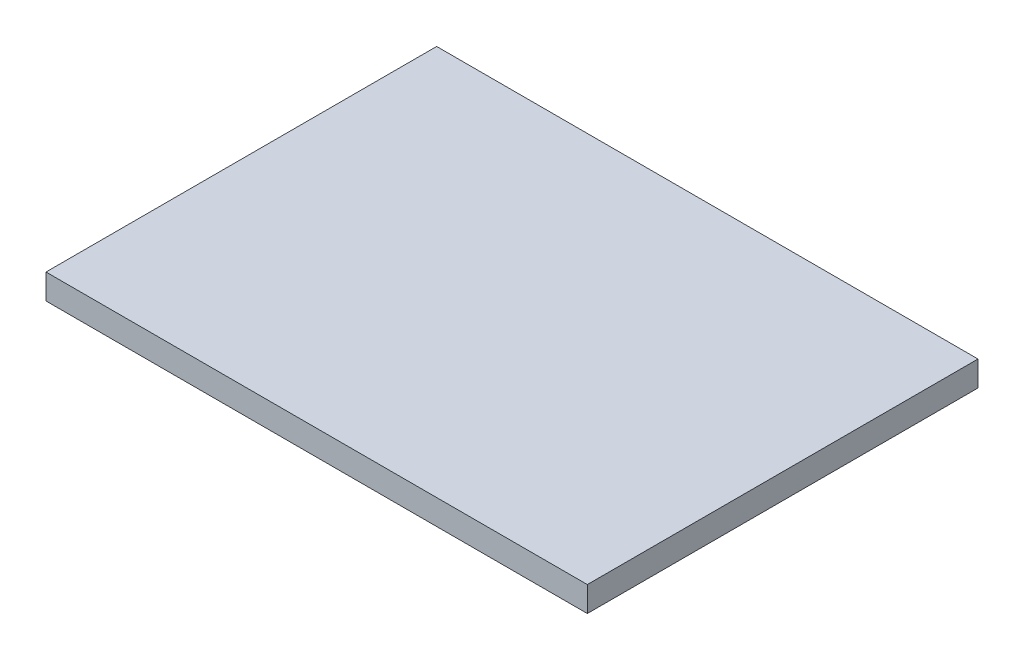
ISO-10303-21;
HEADER;
FILE_DESCRIPTION(('STEP AP214'),'2;1');
FILE_NAME('part.step','',(''),(''),'','','');
FILE_SCHEMA(('AUTOMOTIVE_DESIGN { 1 0 10303 214 1 1 1 1 }'));
ENDSEC;
DATA;
#1=APPLICATION_CONTEXT('core data for automotive mechanical design processes');
#2=APPLICATION_PROTOCOL_DEFINITION('international standard','automotive_design',2000,#1);
#3=PRODUCT_CONTEXT('',#1,'mechanical');
#4=PRODUCT('Part','Part','',(#3));
#5=PRODUCT_RELATED_PRODUCT_CATEGORY('part','',(#4));
#6=PRODUCT_DEFINITION_FORMATION('','',#4);
#7=PRODUCT_DEFINITION_CONTEXT('part definition',#1,'design');
#8=PRODUCT_DEFINITION('design','',#6,#7);
#9=PRODUCT_DEFINITION_SHAPE('','',#8);
#10=(LENGTH_UNIT() NAMED_UNIT(*) SI_UNIT(.MILLI.,.METRE.));
#11=(NAMED_UNIT(*) PLANE_ANGLE_UNIT() SI_UNIT($,.RADIAN.));
#12=(NAMED_UNIT(*) SI_UNIT($,.STERADIAN.) SOLID_ANGLE_UNIT());
#13=UNCERTAINTY_MEASURE_WITH_UNIT(LENGTH_MEASURE(1.E-05),#10,'distance_accuracy_value','');
#14=(GEOMETRIC_REPRESENTATION_CONTEXT(3) GLOBAL_UNCERTAINTY_ASSIGNED_CONTEXT((#13)) GLOBAL_UNIT_ASSIGNED_CONTEXT((#10,
#11,#12)) REPRESENTATION_CONTEXT('',''));
#15=CARTESIAN_POINT('',(0.,0.,0.));
#16=DIRECTION('',(0.,0.,1.));
#17=DIRECTION('',(1.,0.,0.));
#18=AXIS2_PLACEMENT_3D('',#15,#16,#17);
#19=CARTESIAN_POINT('',(0.,18.,0.));
#20=DIRECTION('',(1.,0.,0.));
#21=DIRECTION('',(0.,0.,-1.));
#22=AXIS2_PLACEMENT_3D('',#19,#20,#21);
#23=PLANE('',#22);
#24=DIRECTION('',(0.,0.,1.));
#25=VECTOR('',#24,1.);
#26=CARTESIAN_POINT('',(0.,0.,0.));
#27=LINE('',#26,#25);
#28=CARTESIAN_POINT('',(0.,0.,0.));
#29=VERTEX_POINT('',#28);
#30=CARTESIAN_POINT('',(0.,0.,280.));
#31=VERTEX_POINT('',#30);
#32=EDGE_CURVE('E98',#29,#31,#27,.T.);
#33=ORIENTED_EDGE('',*,*,#32,.T.);
#34=DIRECTION('',(0.,-1.,0.));
#35=VECTOR('',#34,1.);
#36=CARTESIAN_POINT('',(0.,18.,280.));
#37=LINE('',#36,#35);
#38=CARTESIAN_POINT('',(0.,18.,280.));
#39=VERTEX_POINT('',#38);
#40=EDGE_CURVE('E11',#39,#31,#37,.T.);
#41=ORIENTED_EDGE('',*,*,#40,.F.);
#42=DIRECTION('',(0.,0.,1.));
#43=VECTOR('',#42,1.);
#44=CARTESIAN_POINT('',(0.,18.,0.));
#45=LINE('',#44,#43);
#46=CARTESIAN_POINT('',(0.,18.,0.));
#47=VERTEX_POINT('',#46);
#48=EDGE_CURVE('E86',#47,#39,#45,.T.);
#49=ORIENTED_EDGE('',*,*,#48,.F.);
#50=DIRECTION('',(0.,-1.,0.));
#51=VECTOR('',#50,1.);
#52=CARTESIAN_POINT('',(0.,18.,0.));
#53=LINE('',#52,#51);
#54=EDGE_CURVE('E94',#47,#29,#53,.T.);
#55=ORIENTED_EDGE('',*,*,#54,.T.);
#56=EDGE_LOOP('',(#33,#41,#49,#55));
#57=FACE_BOUND('',#56,.T.);
#58=ADVANCED_FACE('F35',(#57),#23,.F.);
#59=CARTESIAN_POINT('',(0.,18.,280.));
#60=DIRECTION('',(0.,0.,-1.));
#61=DIRECTION('',(-1.,0.,0.));
#62=AXIS2_PLACEMENT_3D('',#59,#60,#61);
#63=PLANE('',#62);
#64=DIRECTION('',(1.,0.,0.));
#65=VECTOR('',#64,1.);
#66=CARTESIAN_POINT('',(0.,0.,280.));
#67=LINE('',#66,#65);
#68=CARTESIAN_POINT('',(388.,0.,280.));
#69=VERTEX_POINT('',#68);
#70=EDGE_CURVE('E90',#31,#69,#67,.T.);
#71=ORIENTED_EDGE('',*,*,#70,.T.);
#72=DIRECTION('',(0.,-1.,0.));
#73=VECTOR('',#72,1.);
#74=CARTESIAN_POINT('',(388.,18.,280.));
#75=LINE('',#74,#73);
#76=CARTESIAN_POINT('',(388.,18.,280.));
#77=VERTEX_POINT('',#76);
#78=EDGE_CURVE('E43',#77,#69,#75,.T.);
#79=ORIENTED_EDGE('',*,*,#78,.F.);
#80=DIRECTION('',(1.,0.,0.));
#81=VECTOR('',#80,1.);
#82=CARTESIAN_POINT('',(0.,18.,280.));
#83=LINE('',#82,#81);
#84=EDGE_CURVE('E81',#39,#77,#83,.T.);
#85=ORIENTED_EDGE('',*,*,#84,.F.);
#86=ORIENTED_EDGE('',*,*,#40,.T.);
#87=EDGE_LOOP('',(#71,#79,#85,#86));
#88=FACE_BOUND('',#87,.T.);
#89=ADVANCED_FACE('F89',(#88),#63,.F.);
#90=CARTESIAN_POINT('',(388.,18.,0.));
#91=DIRECTION('',(-1.,0.,0.));
#92=DIRECTION('',(0.,0.,1.));
#93=AXIS2_PLACEMENT_3D('',#90,#91,#92);
#94=PLANE('',#93);
#95=DIRECTION('',(0.,0.,-1.));
#96=VECTOR('',#95,1.);
#97=CARTESIAN_POINT('',(388.,0.,0.));
#98=LINE('',#97,#96);
#99=CARTESIAN_POINT('',(388.,0.,0.));
#100=VERTEX_POINT('',#99);
#101=EDGE_CURVE('E68',#69,#100,#98,.T.);
#102=ORIENTED_EDGE('',*,*,#101,.T.);
#103=DIRECTION('',(0.,-1.,0.));
#104=VECTOR('',#103,1.);
#105=CARTESIAN_POINT('',(388.,18.,0.));
#106=LINE('',#105,#104);
#107=CARTESIAN_POINT('',(388.,18.,0.));
#108=VERTEX_POINT('',#107);
#109=EDGE_CURVE('E91',#108,#100,#106,.T.);
#110=ORIENTED_EDGE('',*,*,#109,.F.);
#111=DIRECTION('',(0.,0.,-1.));
#112=VECTOR('',#111,1.);
#113=CARTESIAN_POINT('',(388.,18.,0.));
#114=LINE('',#113,#112);
#115=EDGE_CURVE('E84',#77,#108,#114,.T.);
#116=ORIENTED_EDGE('',*,*,#115,.F.);
#117=ORIENTED_EDGE('',*,*,#78,.T.);
#118=EDGE_LOOP('',(#102,#110,#116,#117));
#119=FACE_BOUND('',#118,.T.);
#120=ADVANCED_FACE('F92',(#119),#94,.F.);
#121=CARTESIAN_POINT('',(0.,18.,0.));
#122=DIRECTION('',(0.,0.,1.));
#123=DIRECTION('',(1.,0.,0.));
#124=AXIS2_PLACEMENT_3D('',#121,#122,#123);
#125=PLANE('',#124);
#126=DIRECTION('',(-1.,0.,0.));
#127=VECTOR('',#126,1.);
#128=CARTESIAN_POINT('',(0.,0.,0.));
#129=LINE('',#128,#127);
#130=EDGE_CURVE('E74',#100,#29,#129,.T.);
#131=ORIENTED_EDGE('',*,*,#130,.T.);
#132=ORIENTED_EDGE('',*,*,#54,.F.);
#133=DIRECTION('',(-1.,0.,0.));
#134=VECTOR('',#133,1.);
#135=CARTESIAN_POINT('',(0.,18.,0.));
#136=LINE('',#135,#134);
#137=EDGE_CURVE('E51',#108,#47,#136,.T.);
#138=ORIENTED_EDGE('',*,*,#137,.F.);
#139=ORIENTED_EDGE('',*,*,#109,.T.);
#140=EDGE_LOOP('',(#131,#132,#138,#139));
#141=FACE_BOUND('',#140,.T.);
#142=ADVANCED_FACE('F105',(#141),#125,.F.);
#143=CARTESIAN_POINT('',(0.,18.,0.));
#144=DIRECTION('',(0.,1.,0.));
#145=DIRECTION('',(0.,0.,1.));
#146=AXIS2_PLACEMENT_3D('',#143,#144,#145);
#147=PLANE('',#146);
#148=ORIENTED_EDGE('',*,*,#48,.T.);
#149=ORIENTED_EDGE('',*,*,#84,.T.);
#150=ORIENTED_EDGE('',*,*,#115,.T.);
#151=ORIENTED_EDGE('',*,*,#137,.T.);
#152=EDGE_LOOP('',(#148,#149,#150,#151));
#153=FACE_BOUND('',#152,.T.);
#154=ADVANCED_FACE('F82',(#153),#147,.T.);
#155=CARTESIAN_POINT('',(0.,0.,0.));
#156=DIRECTION('',(0.,1.,0.));
#157=DIRECTION('',(0.,0.,1.));
#158=AXIS2_PLACEMENT_3D('',#155,#156,#157);
#159=PLANE('',#158);
#160=ORIENTED_EDGE('',*,*,#32,.F.);
#161=ORIENTED_EDGE('',*,*,#130,.F.);
#162=ORIENTED_EDGE('',*,*,#101,.F.);
#163=ORIENTED_EDGE('',*,*,#70,.F.);
#164=EDGE_LOOP('',(#160,#161,#162,#163));
#165=FACE_BOUND('',#164,.T.);
#166=ADVANCED_FACE('F108',(#165),#159,.F.);
#167=CLOSED_SHELL('',(#58,#89,#120,#142,#154,#166));
#168=MANIFOLD_SOLID_BREP('B2',#167);
#169=ADVANCED_BREP_SHAPE_REPRESENTATION('',(#18,#168),#14);
#170=SHAPE_DEFINITION_REPRESENTATION(#9,#169);
ENDSEC;
END-ISO-10303-21;
